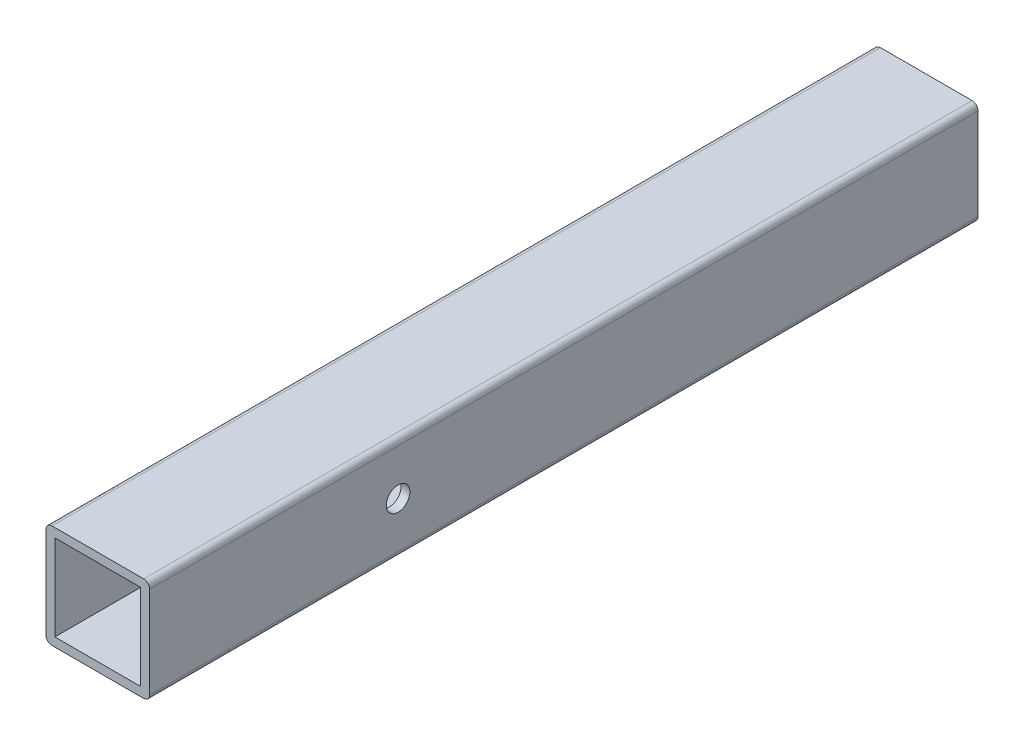
ISO-10303-21;
HEADER;
FILE_DESCRIPTION(('STEP AP214'),'2;1');
FILE_NAME('part.step','',(''),(''),'','','');
FILE_SCHEMA(('AUTOMOTIVE_DESIGN { 1 0 10303 214 1 1 1 1 }'));
ENDSEC;
DATA;
#1=APPLICATION_CONTEXT('core data for automotive mechanical design processes');
#2=APPLICATION_PROTOCOL_DEFINITION('international standard','automotive_design',2000,#1);
#3=PRODUCT_CONTEXT('',#1,'mechanical');
#4=PRODUCT('Part','Part','',(#3));
#5=PRODUCT_RELATED_PRODUCT_CATEGORY('part','',(#4));
#6=PRODUCT_DEFINITION_FORMATION('','',#4);
#7=PRODUCT_DEFINITION_CONTEXT('part definition',#1,'design');
#8=PRODUCT_DEFINITION('design','',#6,#7);
#9=PRODUCT_DEFINITION_SHAPE('','',#8);
#10=(LENGTH_UNIT() NAMED_UNIT(*) SI_UNIT(.MILLI.,.METRE.));
#11=(NAMED_UNIT(*) PLANE_ANGLE_UNIT() SI_UNIT($,.RADIAN.));
#12=(NAMED_UNIT(*) SI_UNIT($,.STERADIAN.) SOLID_ANGLE_UNIT());
#13=UNCERTAINTY_MEASURE_WITH_UNIT(LENGTH_MEASURE(1.E-05),#10,'distance_accuracy_value','');
#14=(GEOMETRIC_REPRESENTATION_CONTEXT(3) GLOBAL_UNCERTAINTY_ASSIGNED_CONTEXT((#13)) GLOBAL_UNIT_ASSIGNED_CONTEXT((#10,
#11,#12)) REPRESENTATION_CONTEXT('',''));
#15=CARTESIAN_POINT('',(0.,0.,0.));
#16=DIRECTION('',(0.,0.,1.));
#17=DIRECTION('',(1.,0.,0.));
#18=AXIS2_PLACEMENT_3D('',#15,#16,#17);
#19=CARTESIAN_POINT('',(17.5,-17.5,-140.));
#20=DIRECTION('',(1.,0.,0.));
#21=DIRECTION('',(0.,0.,-1.));
#22=AXIS2_PLACEMENT_3D('',#19,#20,#21);
#23=PLANE('',#22);
#24=CARTESIAN_POINT('',(17.5,0.,56.));
#25=DIRECTION('',(1.,0.,0.));
#26=DIRECTION('',(0.,0.,-1.));
#27=AXIS2_PLACEMENT_3D('',#24,#25,#26);
#28=CIRCLE('',#27,4.);
#29=CARTESIAN_POINT('',(17.5,0.,52.));
#30=VERTEX_POINT('',#29);
#31=EDGE_CURVE('E349',#30,#30,#28,.T.);
#32=ORIENTED_EDGE('',*,*,#31,.F.);
#33=EDGE_LOOP('',(#32));
#34=FACE_BOUND('',#33,.T.);
#35=DIRECTION('',(0.,1.,0.));
#36=VECTOR('',#35,1.);
#37=CARTESIAN_POINT('',(17.5,-17.5,140.));
#38=LINE('',#37,#36);
#39=CARTESIAN_POINT('',(17.5,-15.5,140.));
#40=VERTEX_POINT('',#39);
#41=CARTESIAN_POINT('',(17.5,15.5,140.));
#42=VERTEX_POINT('',#41);
#43=EDGE_CURVE('E205',#40,#42,#38,.T.);
#44=ORIENTED_EDGE('',*,*,#43,.F.);
#45=DIRECTION('',(0.,0.,1.));
#46=VECTOR('',#45,1.);
#47=CARTESIAN_POINT('',(17.5,-15.5,-140.));
#48=LINE('',#47,#46);
#49=CARTESIAN_POINT('',(17.5,-15.5,-140.));
#50=VERTEX_POINT('',#49);
#51=EDGE_CURVE('E256',#40,#50,#48,.F.);
#52=ORIENTED_EDGE('',*,*,#51,.T.);
#53=DIRECTION('',(0.,1.,0.));
#54=VECTOR('',#53,1.);
#55=CARTESIAN_POINT('',(17.5,-17.5,-140.));
#56=LINE('',#55,#54);
#57=CARTESIAN_POINT('',(17.5,15.5,-140.));
#58=VERTEX_POINT('',#57);
#59=EDGE_CURVE('E226',#50,#58,#56,.T.);
#60=ORIENTED_EDGE('',*,*,#59,.T.);
#61=DIRECTION('',(0.,0.,1.));
#62=VECTOR('',#61,1.);
#63=CARTESIAN_POINT('',(17.5,15.5,-140.));
#64=LINE('',#63,#62);
#65=EDGE_CURVE('E253',#58,#42,#64,.T.);
#66=ORIENTED_EDGE('',*,*,#65,.T.);
#67=EDGE_LOOP('',(#44,#52,#60,#66));
#68=FACE_BOUND('',#67,.T.);
#69=ADVANCED_FACE('F81',(#34,#68),#23,.T.);
#70=CARTESIAN_POINT('',(-17.5,-17.5,-140.));
#71=DIRECTION('',(0.,-1.,0.));
#72=DIRECTION('',(0.,0.,-1.));
#73=AXIS2_PLACEMENT_3D('',#70,#71,#72);
#74=PLANE('',#73);
#75=DIRECTION('',(1.,0.,0.));
#76=VECTOR('',#75,1.);
#77=CARTESIAN_POINT('',(-17.5,-17.5,-140.));
#78=LINE('',#77,#76);
#79=CARTESIAN_POINT('',(-15.5,-17.5,-140.));
#80=VERTEX_POINT('',#79);
#81=CARTESIAN_POINT('',(15.5,-17.5,-140.));
#82=VERTEX_POINT('',#81);
#83=EDGE_CURVE('E237',#80,#82,#78,.T.);
#84=ORIENTED_EDGE('',*,*,#83,.T.);
#85=DIRECTION('',(0.,0.,1.));
#86=VECTOR('',#85,1.);
#87=CARTESIAN_POINT('',(15.5,-17.5,-140.));
#88=LINE('',#87,#86);
#89=CARTESIAN_POINT('',(15.5,-17.5,140.));
#90=VERTEX_POINT('',#89);
#91=EDGE_CURVE('E242',#82,#90,#88,.T.);
#92=ORIENTED_EDGE('',*,*,#91,.T.);
#93=DIRECTION('',(1.,0.,0.));
#94=VECTOR('',#93,1.);
#95=CARTESIAN_POINT('',(-17.5,-17.5,140.));
#96=LINE('',#95,#94);
#97=CARTESIAN_POINT('',(-15.5,-17.5,140.));
#98=VERTEX_POINT('',#97);
#99=EDGE_CURVE('E214',#98,#90,#96,.T.);
#100=ORIENTED_EDGE('',*,*,#99,.F.);
#101=DIRECTION('',(0.,0.,1.));
#102=VECTOR('',#101,1.);
#103=CARTESIAN_POINT('',(-15.5,-17.5,-140.));
#104=LINE('',#103,#102);
#105=EDGE_CURVE('E240',#98,#80,#104,.F.);
#106=ORIENTED_EDGE('',*,*,#105,.T.);
#107=EDGE_LOOP('',(#84,#92,#100,#106));
#108=FACE_BOUND('',#107,.T.);
#109=ADVANCED_FACE('F296',(#108),#74,.T.);
#110=CARTESIAN_POINT('',(-17.5,-17.5,-140.));
#111=DIRECTION('',(-1.,0.,0.));
#112=DIRECTION('',(0.,0.,1.));
#113=AXIS2_PLACEMENT_3D('',#110,#111,#112);
#114=PLANE('',#113);
#115=CARTESIAN_POINT('',(-17.5,0.,56.));
#116=DIRECTION('',(-1.,0.,0.));
#117=DIRECTION('',(0.,0.,1.));
#118=AXIS2_PLACEMENT_3D('',#115,#116,#117);
#119=CIRCLE('',#118,4.);
#120=CARTESIAN_POINT('',(-17.5,0.,60.));
#121=VERTEX_POINT('',#120);
#122=EDGE_CURVE('E194',#121,#121,#119,.T.);
#123=ORIENTED_EDGE('',*,*,#122,.F.);
#124=EDGE_LOOP('',(#123));
#125=FACE_BOUND('',#124,.T.);
#126=DIRECTION('',(0.,-1.,0.));
#127=VECTOR('',#126,1.);
#128=CARTESIAN_POINT('',(-17.5,-17.5,-140.));
#129=LINE('',#128,#127);
#130=CARTESIAN_POINT('',(-17.5,15.5,-140.));
#131=VERTEX_POINT('',#130);
#132=CARTESIAN_POINT('',(-17.5,-15.5,-140.));
#133=VERTEX_POINT('',#132);
#134=EDGE_CURVE('E234',#131,#133,#129,.T.);
#135=ORIENTED_EDGE('',*,*,#134,.T.);
#136=DIRECTION('',(0.,0.,1.));
#137=VECTOR('',#136,1.);
#138=CARTESIAN_POINT('',(-17.5,-15.5,-140.));
#139=LINE('',#138,#137);
#140=CARTESIAN_POINT('',(-17.5,-15.5,140.));
#141=VERTEX_POINT('',#140);
#142=EDGE_CURVE('E267',#133,#141,#139,.T.);
#143=ORIENTED_EDGE('',*,*,#142,.T.);
#144=DIRECTION('',(0.,-1.,0.));
#145=VECTOR('',#144,1.);
#146=CARTESIAN_POINT('',(-17.5,-17.5,140.));
#147=LINE('',#146,#145);
#148=CARTESIAN_POINT('',(-17.5,15.5,140.));
#149=VERTEX_POINT('',#148);
#150=EDGE_CURVE('E211',#149,#141,#147,.T.);
#151=ORIENTED_EDGE('',*,*,#150,.F.);
#152=DIRECTION('',(0.,0.,1.));
#153=VECTOR('',#152,1.);
#154=CARTESIAN_POINT('',(-17.5,15.5,-140.));
#155=LINE('',#154,#153);
#156=EDGE_CURVE('E265',#149,#131,#155,.F.);
#157=ORIENTED_EDGE('',*,*,#156,.T.);
#158=EDGE_LOOP('',(#135,#143,#151,#157));
#159=FACE_BOUND('',#158,.T.);
#160=ADVANCED_FACE('F273',(#125,#159),#114,.T.);
#161=CARTESIAN_POINT('',(-17.5,17.5,-140.));
#162=DIRECTION('',(0.,1.,0.));
#163=DIRECTION('',(0.,0.,1.));
#164=AXIS2_PLACEMENT_3D('',#161,#162,#163);
#165=PLANE('',#164);
#166=DIRECTION('',(-1.,0.,0.));
#167=VECTOR('',#166,1.);
#168=CARTESIAN_POINT('',(-17.5,17.5,-140.));
#169=LINE('',#168,#167);
#170=CARTESIAN_POINT('',(15.5,17.5,-140.));
#171=VERTEX_POINT('',#170);
#172=CARTESIAN_POINT('',(-15.5,17.5,-140.));
#173=VERTEX_POINT('',#172);
#174=EDGE_CURVE('E232',#171,#173,#169,.T.);
#175=ORIENTED_EDGE('',*,*,#174,.T.);
#176=DIRECTION('',(0.,0.,1.));
#177=VECTOR('',#176,1.);
#178=CARTESIAN_POINT('',(-15.5,17.5,-140.));
#179=LINE('',#178,#177);
#180=CARTESIAN_POINT('',(-15.5,17.5,140.));
#181=VERTEX_POINT('',#180);
#182=EDGE_CURVE('E12',#173,#181,#179,.T.);
#183=ORIENTED_EDGE('',*,*,#182,.T.);
#184=DIRECTION('',(-1.,0.,0.));
#185=VECTOR('',#184,1.);
#186=CARTESIAN_POINT('',(-17.5,17.5,140.));
#187=LINE('',#186,#185);
#188=CARTESIAN_POINT('',(15.5,17.5,140.));
#189=VERTEX_POINT('',#188);
#190=EDGE_CURVE('E208',#189,#181,#187,.T.);
#191=ORIENTED_EDGE('',*,*,#190,.F.);
#192=DIRECTION('',(0.,0.,1.));
#193=VECTOR('',#192,1.);
#194=CARTESIAN_POINT('',(15.5,17.5,-140.));
#195=LINE('',#194,#193);
#196=EDGE_CURVE('E90',#189,#171,#195,.F.);
#197=ORIENTED_EDGE('',*,*,#196,.T.);
#198=EDGE_LOOP('',(#175,#183,#191,#197));
#199=FACE_BOUND('',#198,.T.);
#200=ADVANCED_FACE('F282',(#199),#165,.T.);
#201=CARTESIAN_POINT('',(0.,0.,-140.));
#202=DIRECTION('',(0.,0.,1.));
#203=DIRECTION('',(1.,0.,0.));
#204=AXIS2_PLACEMENT_3D('',#201,#202,#203);
#205=PLANE('',#204);
#206=DIRECTION('',(1.,0.,0.));
#207=VECTOR('',#206,1.);
#208=CARTESIAN_POINT('',(0.,-14.5,-140.));
#209=LINE('',#208,#207);
#210=CARTESIAN_POINT('',(-14.5,-14.5,-140.));
#211=VERTEX_POINT('',#210);
#212=CARTESIAN_POINT('',(14.5,-14.5,-140.));
#213=VERTEX_POINT('',#212);
#214=EDGE_CURVE('E185',#211,#213,#209,.T.);
#215=ORIENTED_EDGE('',*,*,#214,.T.);
#216=DIRECTION('',(0.,1.,0.));
#217=VECTOR('',#216,1.);
#218=CARTESIAN_POINT('',(14.5,0.,-140.));
#219=LINE('',#218,#217);
#220=CARTESIAN_POINT('',(14.5,14.5,-140.));
#221=VERTEX_POINT('',#220);
#222=EDGE_CURVE('E217',#213,#221,#219,.T.);
#223=ORIENTED_EDGE('',*,*,#222,.T.);
#224=DIRECTION('',(-1.,0.,0.));
#225=VECTOR('',#224,1.);
#226=CARTESIAN_POINT('',(0.,14.5,-140.));
#227=LINE('',#226,#225);
#228=CARTESIAN_POINT('',(-14.5,14.5,-140.));
#229=VERTEX_POINT('',#228);
#230=EDGE_CURVE('E180',#221,#229,#227,.T.);
#231=ORIENTED_EDGE('',*,*,#230,.T.);
#232=DIRECTION('',(0.,-1.,0.));
#233=VECTOR('',#232,1.);
#234=CARTESIAN_POINT('',(-14.5,0.,-140.));
#235=LINE('',#234,#233);
#236=EDGE_CURVE('E220',#229,#211,#235,.T.);
#237=ORIENTED_EDGE('',*,*,#236,.T.);
#238=EDGE_LOOP('',(#215,#223,#231,#237));
#239=FACE_BOUND('',#238,.T.);
#240=ORIENTED_EDGE('',*,*,#59,.F.);
#241=CARTESIAN_POINT('',(15.5,-15.5,-140.));
#242=DIRECTION('',(0.,0.,1.));
#243=DIRECTION('',(1.,0.,0.));
#244=AXIS2_PLACEMENT_3D('',#241,#242,#243);
#245=CIRCLE('',#244,2.);
#246=EDGE_CURVE('E263',#50,#82,#245,.F.);
#247=ORIENTED_EDGE('',*,*,#246,.T.);
#248=ORIENTED_EDGE('',*,*,#83,.F.);
#249=CARTESIAN_POINT('',(-15.5,-15.5,-140.));
#250=DIRECTION('',(0.,0.,1.));
#251=DIRECTION('',(1.,0.,0.));
#252=AXIS2_PLACEMENT_3D('',#249,#250,#251);
#253=CIRCLE('',#252,2.);
#254=EDGE_CURVE('E261',#80,#133,#253,.F.);
#255=ORIENTED_EDGE('',*,*,#254,.T.);
#256=ORIENTED_EDGE('',*,*,#134,.F.);
#257=CARTESIAN_POINT('',(-15.5,15.5,-140.));
#258=DIRECTION('',(0.,0.,1.));
#259=DIRECTION('',(1.,0.,0.));
#260=AXIS2_PLACEMENT_3D('',#257,#258,#259);
#261=CIRCLE('',#260,2.);
#262=EDGE_CURVE('E97',#131,#173,#261,.F.);
#263=ORIENTED_EDGE('',*,*,#262,.T.);
#264=ORIENTED_EDGE('',*,*,#174,.F.);
#265=CARTESIAN_POINT('',(15.5,15.5,-140.));
#266=DIRECTION('',(0.,0.,1.));
#267=DIRECTION('',(1.,0.,0.));
#268=AXIS2_PLACEMENT_3D('',#265,#266,#267);
#269=CIRCLE('',#268,2.);
#270=EDGE_CURVE('E258',#171,#58,#269,.F.);
#271=ORIENTED_EDGE('',*,*,#270,.T.);
#272=EDGE_LOOP('',(#240,#247,#248,#255,#256,#263,#264,#271));
#273=FACE_BOUND('',#272,.T.);
#274=ADVANCED_FACE('F285',(#239,#273),#205,.F.);
#275=CARTESIAN_POINT('',(14.5,0.,-140.));
#276=DIRECTION('',(1.,0.,0.));
#277=DIRECTION('',(0.,0.,-1.));
#278=AXIS2_PLACEMENT_3D('',#275,#276,#277);
#279=PLANE('',#278);
#280=CARTESIAN_POINT('',(14.5,0.,56.));
#281=DIRECTION('',(1.,0.,0.));
#282=DIRECTION('',(0.,0.,-1.));
#283=AXIS2_PLACEMENT_3D('',#280,#281,#282);
#284=CIRCLE('',#283,4.);
#285=CARTESIAN_POINT('',(14.5,0.,52.));
#286=VERTEX_POINT('',#285);
#287=EDGE_CURVE('E352',#286,#286,#284,.T.);
#288=ORIENTED_EDGE('',*,*,#287,.T.);
#289=EDGE_LOOP('',(#288));
#290=FACE_BOUND('',#289,.T.);
#291=DIRECTION('',(0.,0.,1.));
#292=VECTOR('',#291,1.);
#293=CARTESIAN_POINT('',(14.5,-14.5,-140.));
#294=LINE('',#293,#292);
#295=CARTESIAN_POINT('',(14.5,-14.5,140.));
#296=VERTEX_POINT('',#295);
#297=EDGE_CURVE('E190',#213,#296,#294,.T.);
#298=ORIENTED_EDGE('',*,*,#297,.T.);
#299=DIRECTION('',(0.,1.,0.));
#300=VECTOR('',#299,1.);
#301=CARTESIAN_POINT('',(14.5,0.,140.));
#302=LINE('',#301,#300);
#303=CARTESIAN_POINT('',(14.5,14.5,140.));
#304=VERTEX_POINT('',#303);
#305=EDGE_CURVE('E188',#296,#304,#302,.T.);
#306=ORIENTED_EDGE('',*,*,#305,.T.);
#307=DIRECTION('',(0.,0.,1.));
#308=VECTOR('',#307,1.);
#309=CARTESIAN_POINT('',(14.5,14.5,-140.));
#310=LINE('',#309,#308);
#311=EDGE_CURVE('E172',#221,#304,#310,.T.);
#312=ORIENTED_EDGE('',*,*,#311,.F.);
#313=ORIENTED_EDGE('',*,*,#222,.F.);
#314=EDGE_LOOP('',(#298,#306,#312,#313));
#315=FACE_BOUND('',#314,.T.);
#316=ADVANCED_FACE('F189',(#290,#315),#279,.F.);
#317=CARTESIAN_POINT('',(0.,-14.5,-140.));
#318=DIRECTION('',(0.,-1.,0.));
#319=DIRECTION('',(0.,0.,-1.));
#320=AXIS2_PLACEMENT_3D('',#317,#318,#319);
#321=PLANE('',#320);
#322=DIRECTION('',(0.,0.,1.));
#323=VECTOR('',#322,1.);
#324=CARTESIAN_POINT('',(-14.5,-14.5,-140.));
#325=LINE('',#324,#323);
#326=CARTESIAN_POINT('',(-14.5,-14.5,140.));
#327=VERTEX_POINT('',#326);
#328=EDGE_CURVE('E227',#211,#327,#325,.T.);
#329=ORIENTED_EDGE('',*,*,#328,.T.);
#330=DIRECTION('',(1.,0.,0.));
#331=VECTOR('',#330,1.);
#332=CARTESIAN_POINT('',(0.,-14.5,140.));
#333=LINE('',#332,#331);
#334=EDGE_CURVE('E200',#327,#296,#333,.T.);
#335=ORIENTED_EDGE('',*,*,#334,.T.);
#336=ORIENTED_EDGE('',*,*,#297,.F.);
#337=ORIENTED_EDGE('',*,*,#214,.F.);
#338=EDGE_LOOP('',(#329,#335,#336,#337));
#339=FACE_BOUND('',#338,.T.);
#340=ADVANCED_FACE('F326',(#339),#321,.F.);
#341=CARTESIAN_POINT('',(-14.5,0.,-140.));
#342=DIRECTION('',(-1.,0.,0.));
#343=DIRECTION('',(0.,0.,1.));
#344=AXIS2_PLACEMENT_3D('',#341,#342,#343);
#345=PLANE('',#344);
#346=CARTESIAN_POINT('',(-14.5,0.,56.));
#347=DIRECTION('',(-1.,0.,0.));
#348=DIRECTION('',(0.,0.,1.));
#349=AXIS2_PLACEMENT_3D('',#346,#347,#348);
#350=CIRCLE('',#349,4.);
#351=CARTESIAN_POINT('',(-14.5,0.,60.));
#352=VERTEX_POINT('',#351);
#353=EDGE_CURVE('E85',#352,#352,#350,.T.);
#354=ORIENTED_EDGE('',*,*,#353,.T.);
#355=EDGE_LOOP('',(#354));
#356=FACE_BOUND('',#355,.T.);
#357=DIRECTION('',(0.,0.,1.));
#358=VECTOR('',#357,1.);
#359=CARTESIAN_POINT('',(-14.5,14.5,-140.));
#360=LINE('',#359,#358);
#361=CARTESIAN_POINT('',(-14.5,14.5,140.));
#362=VERTEX_POINT('',#361);
#363=EDGE_CURVE('E184',#229,#362,#360,.T.);
#364=ORIENTED_EDGE('',*,*,#363,.T.);
#365=DIRECTION('',(0.,-1.,0.));
#366=VECTOR('',#365,1.);
#367=CARTESIAN_POINT('',(-14.5,0.,140.));
#368=LINE('',#367,#366);
#369=EDGE_CURVE('E198',#362,#327,#368,.T.);
#370=ORIENTED_EDGE('',*,*,#369,.T.);
#371=ORIENTED_EDGE('',*,*,#328,.F.);
#372=ORIENTED_EDGE('',*,*,#236,.F.);
#373=EDGE_LOOP('',(#364,#370,#371,#372));
#374=FACE_BOUND('',#373,.T.);
#375=ADVANCED_FACE('F330',(#356,#374),#345,.F.);
#376=CARTESIAN_POINT('',(0.,14.5,-140.));
#377=DIRECTION('',(0.,1.,0.));
#378=DIRECTION('',(0.,0.,1.));
#379=AXIS2_PLACEMENT_3D('',#376,#377,#378);
#380=PLANE('',#379);
#381=ORIENTED_EDGE('',*,*,#311,.T.);
#382=DIRECTION('',(-1.,0.,0.));
#383=VECTOR('',#382,1.);
#384=CARTESIAN_POINT('',(0.,14.5,140.));
#385=LINE('',#384,#383);
#386=EDGE_CURVE('E177',#304,#362,#385,.T.);
#387=ORIENTED_EDGE('',*,*,#386,.T.);
#388=ORIENTED_EDGE('',*,*,#363,.F.);
#389=ORIENTED_EDGE('',*,*,#230,.F.);
#390=EDGE_LOOP('',(#381,#387,#388,#389));
#391=FACE_BOUND('',#390,.T.);
#392=ADVANCED_FACE('F174',(#391),#380,.F.);
#393=CARTESIAN_POINT('',(0.,0.,140.));
#394=DIRECTION('',(0.,0.,1.));
#395=DIRECTION('',(1.,0.,0.));
#396=AXIS2_PLACEMENT_3D('',#393,#394,#395);
#397=PLANE('',#396);
#398=ORIENTED_EDGE('',*,*,#99,.T.);
#399=CARTESIAN_POINT('',(15.5,-15.5,140.));
#400=DIRECTION('',(0.,0.,1.));
#401=DIRECTION('',(1.,0.,0.));
#402=AXIS2_PLACEMENT_3D('',#399,#400,#401);
#403=CIRCLE('',#402,2.);
#404=EDGE_CURVE('E251',#90,#40,#403,.T.);
#405=ORIENTED_EDGE('',*,*,#404,.T.);
#406=ORIENTED_EDGE('',*,*,#43,.T.);
#407=CARTESIAN_POINT('',(15.5,15.5,140.));
#408=DIRECTION('',(0.,0.,1.));
#409=DIRECTION('',(1.,0.,0.));
#410=AXIS2_PLACEMENT_3D('',#407,#408,#409);
#411=CIRCLE('',#410,2.);
#412=EDGE_CURVE('E245',#42,#189,#411,.T.);
#413=ORIENTED_EDGE('',*,*,#412,.T.);
#414=ORIENTED_EDGE('',*,*,#190,.T.);
#415=CARTESIAN_POINT('',(-15.5,15.5,140.));
#416=DIRECTION('',(0.,0.,1.));
#417=DIRECTION('',(1.,0.,0.));
#418=AXIS2_PLACEMENT_3D('',#415,#416,#417);
#419=CIRCLE('',#418,2.);
#420=EDGE_CURVE('E247',#181,#149,#419,.T.);
#421=ORIENTED_EDGE('',*,*,#420,.T.);
#422=ORIENTED_EDGE('',*,*,#150,.T.);
#423=CARTESIAN_POINT('',(-15.5,-15.5,140.));
#424=DIRECTION('',(0.,0.,1.));
#425=DIRECTION('',(1.,0.,0.));
#426=AXIS2_PLACEMENT_3D('',#423,#424,#425);
#427=CIRCLE('',#426,2.);
#428=EDGE_CURVE('E249',#141,#98,#427,.T.);
#429=ORIENTED_EDGE('',*,*,#428,.T.);
#430=EDGE_LOOP('',(#398,#405,#406,#413,#414,#421,#422,#429));
#431=FACE_BOUND('',#430,.T.);
#432=ORIENTED_EDGE('',*,*,#386,.F.);
#433=ORIENTED_EDGE('',*,*,#305,.F.);
#434=ORIENTED_EDGE('',*,*,#334,.F.);
#435=ORIENTED_EDGE('',*,*,#369,.F.);
#436=EDGE_LOOP('',(#432,#433,#434,#435));
#437=FACE_BOUND('',#436,.T.);
#438=ADVANCED_FACE('F196',(#431,#437),#397,.T.);
#439=CARTESIAN_POINT('',(15.5,-15.5,-140.));
#440=DIRECTION('',(0.,0.,1.));
#441=DIRECTION('',(1.,0.,0.));
#442=AXIS2_PLACEMENT_3D('',#439,#440,#441);
#443=CYLINDRICAL_SURFACE('',#442,2.);
#444=ORIENTED_EDGE('',*,*,#246,.F.);
#445=ORIENTED_EDGE('',*,*,#51,.F.);
#446=ORIENTED_EDGE('',*,*,#404,.F.);
#447=ORIENTED_EDGE('',*,*,#91,.F.);
#448=EDGE_LOOP('',(#444,#445,#446,#447));
#449=FACE_BOUND('',#448,.T.);
#450=ADVANCED_FACE('F294',(#449),#443,.T.);
#451=CARTESIAN_POINT('',(-15.5,-15.5,-140.));
#452=DIRECTION('',(0.,0.,1.));
#453=DIRECTION('',(1.,0.,0.));
#454=AXIS2_PLACEMENT_3D('',#451,#452,#453);
#455=CYLINDRICAL_SURFACE('',#454,2.);
#456=ORIENTED_EDGE('',*,*,#254,.F.);
#457=ORIENTED_EDGE('',*,*,#105,.F.);
#458=ORIENTED_EDGE('',*,*,#428,.F.);
#459=ORIENTED_EDGE('',*,*,#142,.F.);
#460=EDGE_LOOP('',(#456,#457,#458,#459));
#461=FACE_BOUND('',#460,.T.);
#462=ADVANCED_FACE('F299',(#461),#455,.T.);
#463=CARTESIAN_POINT('',(-15.5,15.5,-140.));
#464=DIRECTION('',(0.,0.,1.));
#465=DIRECTION('',(1.,0.,0.));
#466=AXIS2_PLACEMENT_3D('',#463,#464,#465);
#467=CYLINDRICAL_SURFACE('',#466,2.);
#468=ORIENTED_EDGE('',*,*,#262,.F.);
#469=ORIENTED_EDGE('',*,*,#156,.F.);
#470=ORIENTED_EDGE('',*,*,#420,.F.);
#471=ORIENTED_EDGE('',*,*,#182,.F.);
#472=EDGE_LOOP('',(#468,#469,#470,#471));
#473=FACE_BOUND('',#472,.T.);
#474=ADVANCED_FACE('F281',(#473),#467,.T.);
#475=CARTESIAN_POINT('',(15.5,15.5,-140.));
#476=DIRECTION('',(0.,0.,1.));
#477=DIRECTION('',(1.,0.,0.));
#478=AXIS2_PLACEMENT_3D('',#475,#476,#477);
#479=CYLINDRICAL_SURFACE('',#478,2.);
#480=ORIENTED_EDGE('',*,*,#270,.F.);
#481=ORIENTED_EDGE('',*,*,#196,.F.);
#482=ORIENTED_EDGE('',*,*,#412,.F.);
#483=ORIENTED_EDGE('',*,*,#65,.F.);
#484=EDGE_LOOP('',(#480,#481,#482,#483));
#485=FACE_BOUND('',#484,.T.);
#486=ADVANCED_FACE('F83',(#485),#479,.T.);
#487=CARTESIAN_POINT('',(-22.5,0.,56.));
#488=DIRECTION('',(1.,0.,0.));
#489=DIRECTION('',(0.,0.,-1.));
#490=AXIS2_PLACEMENT_3D('',#487,#488,#489);
#491=CYLINDRICAL_SURFACE('',#490,4.);
#492=ORIENTED_EDGE('',*,*,#122,.T.);
#493=EDGE_LOOP('',(#492));
#494=FACE_BOUND('',#493,.T.);
#495=ORIENTED_EDGE('',*,*,#353,.F.);
#496=EDGE_LOOP('',(#495));
#497=FACE_BOUND('',#496,.T.);
#498=ADVANCED_FACE('F341',(#494,#497),#491,.F.);
#499=ORIENTED_EDGE('',*,*,#31,.T.);
#500=EDGE_LOOP('',(#499));
#501=FACE_BOUND('',#500,.T.);
#502=ORIENTED_EDGE('',*,*,#287,.F.);
#503=EDGE_LOOP('',(#502));
#504=FACE_BOUND('',#503,.T.);
#505=ADVANCED_FACE('F339',(#501,#504),#491,.F.);
#506=CLOSED_SHELL('',(#69,#109,#160,#200,#274,#316,#340,#375,#392,#438,#450,#462,#474,#486,#498,#505));
#507=MANIFOLD_SOLID_BREP('B2',#506);
#508=ADVANCED_BREP_SHAPE_REPRESENTATION('',(#18,#507),#14);
#509=SHAPE_DEFINITION_REPRESENTATION(#9,#508);
ENDSEC;
END-ISO-10303-21;
